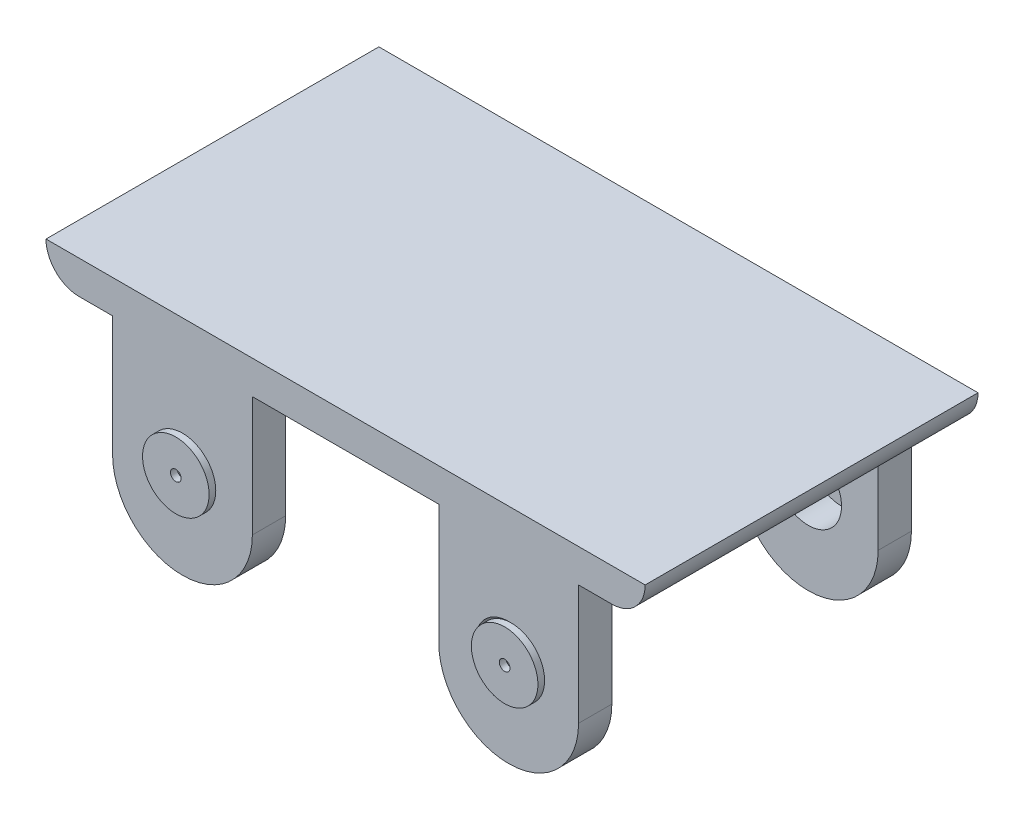
ISO-10303-21;
HEADER;
FILE_DESCRIPTION(('STEP AP214'),'2;1');
FILE_NAME('part.step','',(''),(''),'','','');
FILE_SCHEMA(('AUTOMOTIVE_DESIGN { 1 0 10303 214 1 1 1 1 }'));
ENDSEC;
DATA;
#1=APPLICATION_CONTEXT('core data for automotive mechanical design processes');
#2=APPLICATION_PROTOCOL_DEFINITION('international standard','automotive_design',2000,#1);
#3=PRODUCT_CONTEXT('',#1,'mechanical');
#4=PRODUCT('Part','Part','',(#3));
#5=PRODUCT_RELATED_PRODUCT_CATEGORY('part','',(#4));
#6=PRODUCT_DEFINITION_FORMATION('','',#4);
#7=PRODUCT_DEFINITION_CONTEXT('part definition',#1,'design');
#8=PRODUCT_DEFINITION('design','',#6,#7);
#9=PRODUCT_DEFINITION_SHAPE('','',#8);
#10=(LENGTH_UNIT() NAMED_UNIT(*) SI_UNIT(.MILLI.,.METRE.));
#11=(NAMED_UNIT(*) PLANE_ANGLE_UNIT() SI_UNIT($,.RADIAN.));
#12=(NAMED_UNIT(*) SI_UNIT($,.STERADIAN.) SOLID_ANGLE_UNIT());
#13=UNCERTAINTY_MEASURE_WITH_UNIT(LENGTH_MEASURE(1.E-05),#10,'distance_accuracy_value','');
#14=(GEOMETRIC_REPRESENTATION_CONTEXT(3) GLOBAL_UNCERTAINTY_ASSIGNED_CONTEXT((#13)) GLOBAL_UNIT_ASSIGNED_CONTEXT((#10,
#11,#12)) REPRESENTATION_CONTEXT('',''));
#15=CARTESIAN_POINT('',(0.,0.,0.));
#16=DIRECTION('',(0.,0.,1.));
#17=DIRECTION('',(1.,0.,0.));
#18=AXIS2_PLACEMENT_3D('',#15,#16,#17);
#19=CARTESIAN_POINT('',(0.,0.,0.));
#20=DIRECTION('',(0.,-1.,0.));
#21=DIRECTION('',(0.,0.,-1.));
#22=AXIS2_PLACEMENT_3D('',#19,#20,#21);
#23=PLANE('',#22);
#24=DIRECTION('',(-1.,0.,0.));
#25=VECTOR('',#24,1.);
#26=CARTESIAN_POINT('',(0.,0.,-50.));
#27=LINE('',#26,#25);
#28=CARTESIAN_POINT('',(10.,0.,-50.));
#29=VERTEX_POINT('',#28);
#30=CARTESIAN_POINT('',(5.,0.,-50.));
#31=VERTEX_POINT('',#30);
#32=EDGE_CURVE('E212',#29,#31,#27,.T.);
#33=ORIENTED_EDGE('',*,*,#32,.F.);
#34=DIRECTION('',(0.,0.,-1.));
#35=VECTOR('',#34,1.);
#36=CARTESIAN_POINT('',(10.,0.,-45.));
#37=LINE('',#36,#35);
#38=CARTESIAN_POINT('',(10.,0.,-45.));
#39=VERTEX_POINT('',#38);
#40=EDGE_CURVE('E194',#39,#29,#37,.T.);
#41=ORIENTED_EDGE('',*,*,#40,.F.);
#42=DIRECTION('',(-1.,0.,0.));
#43=VECTOR('',#42,1.);
#44=CARTESIAN_POINT('',(31.,0.,-45.));
#45=LINE('',#44,#43);
#46=CARTESIAN_POINT('',(31.,0.,-45.));
#47=VERTEX_POINT('',#46);
#48=EDGE_CURVE('E271',#47,#39,#45,.T.);
#49=ORIENTED_EDGE('',*,*,#48,.F.);
#50=DIRECTION('',(0.,0.,-1.));
#51=VECTOR('',#50,1.);
#52=CARTESIAN_POINT('',(31.,0.,-45.));
#53=LINE('',#52,#51);
#54=CARTESIAN_POINT('',(31.,0.,-50.));
#55=VERTEX_POINT('',#54);
#56=EDGE_CURVE('E315',#47,#55,#53,.T.);
#57=ORIENTED_EDGE('',*,*,#56,.T.);
#58=CARTESIAN_POINT('',(59.,0.,-50.));
#59=VERTEX_POINT('',#58);
#60=EDGE_CURVE('E224',#59,#55,#27,.T.);
#61=ORIENTED_EDGE('',*,*,#60,.F.);
#62=DIRECTION('',(0.,0.,-1.));
#63=VECTOR('',#62,1.);
#64=CARTESIAN_POINT('',(59.,0.,-45.));
#65=LINE('',#64,#63);
#66=CARTESIAN_POINT('',(59.,0.,-45.));
#67=VERTEX_POINT('',#66);
#68=EDGE_CURVE('E342',#67,#59,#65,.T.);
#69=ORIENTED_EDGE('',*,*,#68,.F.);
#70=DIRECTION('',(-1.,0.,0.));
#71=VECTOR('',#70,1.);
#72=CARTESIAN_POINT('',(80.,0.,-45.));
#73=LINE('',#72,#71);
#74=CARTESIAN_POINT('',(80.,0.,-45.));
#75=VERTEX_POINT('',#74);
#76=EDGE_CURVE('E326',#75,#67,#73,.T.);
#77=ORIENTED_EDGE('',*,*,#76,.F.);
#78=DIRECTION('',(0.,0.,-1.));
#79=VECTOR('',#78,1.);
#80=CARTESIAN_POINT('',(80.,0.,-45.));
#81=LINE('',#80,#79);
#82=CARTESIAN_POINT('',(80.,0.,-50.));
#83=VERTEX_POINT('',#82);
#84=EDGE_CURVE('E319',#75,#83,#81,.T.);
#85=ORIENTED_EDGE('',*,*,#84,.T.);
#86=CARTESIAN_POINT('',(85.,0.,-50.));
#87=VERTEX_POINT('',#86);
#88=EDGE_CURVE('E226',#87,#83,#27,.T.);
#89=ORIENTED_EDGE('',*,*,#88,.F.);
#90=DIRECTION('',(0.,0.,1.));
#91=VECTOR('',#90,1.);
#92=CARTESIAN_POINT('',(85.,0.,0.));
#93=LINE('',#92,#91);
#94=CARTESIAN_POINT('',(85.,0.,0.));
#95=VERTEX_POINT('',#94);
#96=EDGE_CURVE('E354',#87,#95,#93,.T.);
#97=ORIENTED_EDGE('',*,*,#96,.T.);
#98=DIRECTION('',(1.,0.,0.));
#99=VECTOR('',#98,1.);
#100=CARTESIAN_POINT('',(0.,0.,0.));
#101=LINE('',#100,#99);
#102=CARTESIAN_POINT('',(79.9999999999999,0.,0.));
#103=VERTEX_POINT('',#102);
#104=EDGE_CURVE('E243',#103,#95,#101,.T.);
#105=ORIENTED_EDGE('',*,*,#104,.F.);
#106=DIRECTION('',(0.,0.,1.));
#107=VECTOR('',#106,1.);
#108=CARTESIAN_POINT('',(80.,0.,-5.));
#109=LINE('',#108,#107);
#110=CARTESIAN_POINT('',(80.,0.,-5.));
#111=VERTEX_POINT('',#110);
#112=EDGE_CURVE('E370',#111,#103,#109,.T.);
#113=ORIENTED_EDGE('',*,*,#112,.F.);
#114=DIRECTION('',(1.,0.,0.));
#115=VECTOR('',#114,1.);
#116=CARTESIAN_POINT('',(0.,0.,-5.));
#117=LINE('',#116,#115);
#118=CARTESIAN_POINT('',(59.,0.,-5.));
#119=VERTEX_POINT('',#118);
#120=EDGE_CURVE('E365',#119,#111,#117,.T.);
#121=ORIENTED_EDGE('',*,*,#120,.F.);
#122=DIRECTION('',(0.,0.,1.));
#123=VECTOR('',#122,1.);
#124=CARTESIAN_POINT('',(59.,0.,-5.));
#125=LINE('',#124,#123);
#126=CARTESIAN_POINT('',(59.,0.,0.));
#127=VERTEX_POINT('',#126);
#128=EDGE_CURVE('E387',#119,#127,#125,.T.);
#129=ORIENTED_EDGE('',*,*,#128,.T.);
#130=CARTESIAN_POINT('',(31.,0.,0.));
#131=VERTEX_POINT('',#130);
#132=EDGE_CURVE('E251',#131,#127,#101,.T.);
#133=ORIENTED_EDGE('',*,*,#132,.F.);
#134=DIRECTION('',(0.,0.,1.));
#135=VECTOR('',#134,1.);
#136=CARTESIAN_POINT('',(31.,0.,-5.));
#137=LINE('',#136,#135);
#138=CARTESIAN_POINT('',(31.,0.,-5.));
#139=VERTEX_POINT('',#138);
#140=EDGE_CURVE('E401',#139,#131,#137,.T.);
#141=ORIENTED_EDGE('',*,*,#140,.F.);
#142=DIRECTION('',(-1.,0.,0.));
#143=VECTOR('',#142,1.);
#144=CARTESIAN_POINT('',(0.,0.,-5.));
#145=LINE('',#144,#143);
#146=CARTESIAN_POINT('',(10.,0.,-5.));
#147=VERTEX_POINT('',#146);
#148=EDGE_CURVE('E391',#139,#147,#145,.T.);
#149=ORIENTED_EDGE('',*,*,#148,.T.);
#150=DIRECTION('',(0.,0.,1.));
#151=VECTOR('',#150,1.);
#152=CARTESIAN_POINT('',(10.,0.,-5.));
#153=LINE('',#152,#151);
#154=CARTESIAN_POINT('',(10.,0.,0.));
#155=VERTEX_POINT('',#154);
#156=EDGE_CURVE('E260',#147,#155,#153,.T.);
#157=ORIENTED_EDGE('',*,*,#156,.T.);
#158=CARTESIAN_POINT('',(5.,0.,0.));
#159=VERTEX_POINT('',#158);
#160=EDGE_CURVE('E252',#159,#155,#101,.T.);
#161=ORIENTED_EDGE('',*,*,#160,.F.);
#162=DIRECTION('',(0.,0.,1.));
#163=VECTOR('',#162,1.);
#164=CARTESIAN_POINT('',(5.,0.,-50.));
#165=LINE('',#164,#163);
#166=EDGE_CURVE('E220',#159,#31,#165,.F.);
#167=ORIENTED_EDGE('',*,*,#166,.T.);
#168=EDGE_LOOP('',(#33,#41,#49,#57,#61,#69,#77,#85,#89,#97,#105,#113,#121,#129,#133,#141,#149,
#157,#161,#167));
#169=FACE_BOUND('',#168,.T.);
#170=ADVANCED_FACE('F50',(#169),#23,.T.);
#171=CARTESIAN_POINT('',(85.,5.,0.));
#172=DIRECTION('',(0.,0.,-1.));
#173=DIRECTION('',(-1.,0.,0.));
#174=AXIS2_PLACEMENT_3D('',#171,#172,#173);
#175=CYLINDRICAL_SURFACE('',#174,5.);
#176=ORIENTED_EDGE('',*,*,#96,.F.);
#177=CARTESIAN_POINT('',(85.,5.,-50.));
#178=DIRECTION('',(0.,0.,1.));
#179=DIRECTION('',(1.,0.,0.));
#180=AXIS2_PLACEMENT_3D('',#177,#178,#179);
#181=CIRCLE('',#180,5.);
#182=CARTESIAN_POINT('',(90.,5.,-50.));
#183=VERTEX_POINT('',#182);
#184=EDGE_CURVE('E229',#183,#87,#181,.F.);
#185=ORIENTED_EDGE('',*,*,#184,.F.);
#186=DIRECTION('',(0.,0.,-1.));
#187=VECTOR('',#186,1.);
#188=CARTESIAN_POINT('',(90.,5.,0.));
#189=LINE('',#188,#187);
#190=CARTESIAN_POINT('',(90.,5.,0.));
#191=VERTEX_POINT('',#190);
#192=EDGE_CURVE('E444',#191,#183,#189,.T.);
#193=ORIENTED_EDGE('',*,*,#192,.F.);
#194=CARTESIAN_POINT('',(85.,5.,0.));
#195=DIRECTION('',(0.,0.,-1.));
#196=DIRECTION('',(-1.,0.,0.));
#197=AXIS2_PLACEMENT_3D('',#194,#195,#196);
#198=CIRCLE('',#197,5.);
#199=EDGE_CURVE('E239',#95,#191,#198,.F.);
#200=ORIENTED_EDGE('',*,*,#199,.F.);
#201=EDGE_LOOP('',(#176,#185,#193,#200));
#202=FACE_BOUND('',#201,.T.);
#203=ADVANCED_FACE('F511',(#202),#175,.T.);
#204=CARTESIAN_POINT('',(0.,5.,0.));
#205=DIRECTION('',(0.,0.,-1.));
#206=DIRECTION('',(-1.,0.,0.));
#207=AXIS2_PLACEMENT_3D('',#204,#205,#206);
#208=PLANE('',#207);
#209=CARTESIAN_POINT('',(69.5,-15.,0.));
#210=DIRECTION('',(0.,0.,1.));
#211=DIRECTION('',(1.,0.,0.));
#212=AXIS2_PLACEMENT_3D('',#209,#210,#211);
#213=CIRCLE('',#212,5.);
#214=CARTESIAN_POINT('',(69.6979157307919,-10.0039185991915,0.));
#215=VERTEX_POINT('',#214);
#216=CARTESIAN_POINT('',(69.6979157307919,-19.9960814008086,0.));
#217=VERTEX_POINT('',#216);
#218=EDGE_CURVE('E66',#215,#217,#213,.T.);
#219=ORIENTED_EDGE('',*,*,#218,.F.);
#220=CARTESIAN_POINT('',(69.8958314615839,-15.,0.));
#221=DIRECTION('',(0.,0.,-1.));
#222=DIRECTION('',(-1.,0.,0.));
#223=AXIS2_PLACEMENT_3D('',#220,#221,#222);
#224=CIRCLE('',#223,5.);
#225=EDGE_CURVE('E262',#217,#215,#224,.F.);
#226=ORIENTED_EDGE('',*,*,#225,.F.);
#227=EDGE_LOOP('',(#219,#226));
#228=FACE_BOUND('',#227,.T.);
#229=CARTESIAN_POINT('',(20.5,-15.,0.));
#230=DIRECTION('',(0.,0.,1.));
#231=DIRECTION('',(1.,0.,0.));
#232=AXIS2_PLACEMENT_3D('',#229,#230,#231);
#233=CIRCLE('',#232,5.);
#234=CARTESIAN_POINT('',(25.5,-15.,0.));
#235=VERTEX_POINT('',#234);
#236=EDGE_CURVE('E258',#235,#235,#233,.F.);
#237=ORIENTED_EDGE('',*,*,#236,.T.);
#238=EDGE_LOOP('',(#237));
#239=FACE_BOUND('',#238,.T.);
#240=DIRECTION('',(1.,0.,0.));
#241=VECTOR('',#240,1.);
#242=CARTESIAN_POINT('',(0.,5.,0.));
#243=LINE('',#242,#241);
#244=CARTESIAN_POINT('',(0.,5.,0.));
#245=VERTEX_POINT('',#244);
#246=EDGE_CURVE('E441',#245,#191,#243,.T.);
#247=ORIENTED_EDGE('',*,*,#246,.F.);
#248=CARTESIAN_POINT('',(5.,5.,0.));
#249=DIRECTION('',(0.,0.,-1.));
#250=DIRECTION('',(-1.,0.,0.));
#251=AXIS2_PLACEMENT_3D('',#248,#249,#250);
#252=CIRCLE('',#251,5.);
#253=EDGE_CURVE('E255',#245,#159,#252,.F.);
#254=ORIENTED_EDGE('',*,*,#253,.T.);
#255=ORIENTED_EDGE('',*,*,#160,.T.);
#256=DIRECTION('',(0.,-1.,0.));
#257=VECTOR('',#256,1.);
#258=CARTESIAN_POINT('',(10.,0.,0.));
#259=LINE('',#258,#257);
#260=CARTESIAN_POINT('',(10.,-18.,0.));
#261=VERTEX_POINT('',#260);
#262=EDGE_CURVE('E423',#155,#261,#259,.T.);
#263=ORIENTED_EDGE('',*,*,#262,.T.);
#264=CARTESIAN_POINT('',(20.5,-18.,0.));
#265=DIRECTION('',(0.,0.,1.));
#266=DIRECTION('',(1.,0.,0.));
#267=AXIS2_PLACEMENT_3D('',#264,#265,#266);
#268=CIRCLE('',#267,10.5);
#269=CARTESIAN_POINT('',(31.,-18.,0.));
#270=VERTEX_POINT('',#269);
#271=EDGE_CURVE('E415',#270,#261,#268,.F.);
#272=ORIENTED_EDGE('',*,*,#271,.F.);
#273=DIRECTION('',(0.,1.,0.));
#274=VECTOR('',#273,1.);
#275=CARTESIAN_POINT('',(31.,0.,0.));
#276=LINE('',#275,#274);
#277=EDGE_CURVE('E420',#270,#131,#276,.T.);
#278=ORIENTED_EDGE('',*,*,#277,.T.);
#279=ORIENTED_EDGE('',*,*,#132,.T.);
#280=DIRECTION('',(0.,1.,0.));
#281=VECTOR('',#280,1.);
#282=CARTESIAN_POINT('',(59.,0.,0.));
#283=LINE('',#282,#281);
#284=CARTESIAN_POINT('',(59.,-18.,0.));
#285=VERTEX_POINT('',#284);
#286=EDGE_CURVE('E375',#285,#127,#283,.T.);
#287=ORIENTED_EDGE('',*,*,#286,.F.);
#288=CARTESIAN_POINT('',(69.5,-18.,0.));
#289=DIRECTION('',(0.,0.,1.));
#290=DIRECTION('',(1.,0.,0.));
#291=AXIS2_PLACEMENT_3D('',#288,#289,#290);
#292=CIRCLE('',#291,10.5);
#293=CARTESIAN_POINT('',(80.,-18.,0.));
#294=VERTEX_POINT('',#293);
#295=EDGE_CURVE('E250',#285,#294,#292,.T.);
#296=ORIENTED_EDGE('',*,*,#295,.T.);
#297=DIRECTION('',(0.,-1.,0.));
#298=VECTOR('',#297,1.);
#299=CARTESIAN_POINT('',(80.,0.,0.));
#300=LINE('',#299,#298);
#301=EDGE_CURVE('E383',#103,#294,#300,.T.);
#302=ORIENTED_EDGE('',*,*,#301,.F.);
#303=ORIENTED_EDGE('',*,*,#104,.T.);
#304=ORIENTED_EDGE('',*,*,#199,.T.);
#305=EDGE_LOOP('',(#247,#254,#255,#263,#272,#278,#279,#287,#296,#302,#303,#304));
#306=FACE_BOUND('',#305,.T.);
#307=ADVANCED_FACE('F456',(#228,#239,#306),#208,.F.);
#308=CARTESIAN_POINT('',(0.,5.,-50.));
#309=DIRECTION('',(0.,0.,1.));
#310=DIRECTION('',(1.,0.,0.));
#311=AXIS2_PLACEMENT_3D('',#308,#309,#310);
#312=PLANE('',#311);
#313=CARTESIAN_POINT('',(69.5,-15.,-50.0000000000005));
#314=DIRECTION('',(0.,0.,-1.));
#315=DIRECTION('',(-1.,0.,0.));
#316=AXIS2_PLACEMENT_3D('',#313,#314,#315);
#317=CIRCLE('',#316,4.99999999999999);
#318=CARTESIAN_POINT('',(64.5,-15.,-50.0000000000005));
#319=VERTEX_POINT('',#318);
#320=EDGE_CURVE('E54',#319,#319,#317,.F.);
#321=ORIENTED_EDGE('',*,*,#320,.T.);
#322=EDGE_LOOP('',(#321));
#323=FACE_BOUND('',#322,.T.);
#324=CARTESIAN_POINT('',(20.5,-15.,-50.0000000000001));
#325=DIRECTION('',(0.,0.,-1.));
#326=DIRECTION('',(-1.,0.,0.));
#327=AXIS2_PLACEMENT_3D('',#324,#325,#326);
#328=CIRCLE('',#327,5.);
#329=CARTESIAN_POINT('',(15.5,-15.,-50.0000000000001));
#330=VERTEX_POINT('',#329);
#331=EDGE_CURVE('E12',#330,#330,#328,.T.);
#332=ORIENTED_EDGE('',*,*,#331,.F.);
#333=EDGE_LOOP('',(#332));
#334=FACE_BOUND('',#333,.T.);
#335=ORIENTED_EDGE('',*,*,#88,.T.);
#336=DIRECTION('',(0.,1.,0.));
#337=VECTOR('',#336,1.);
#338=CARTESIAN_POINT('',(80.,0.,-50.));
#339=LINE('',#338,#337);
#340=CARTESIAN_POINT('',(80.,-18.,-50.));
#341=VERTEX_POINT('',#340);
#342=EDGE_CURVE('E348',#341,#83,#339,.T.);
#343=ORIENTED_EDGE('',*,*,#342,.F.);
#344=CARTESIAN_POINT('',(69.5,-18.,-50.));
#345=DIRECTION('',(0.,0.,1.));
#346=DIRECTION('',(-1.,0.,0.));
#347=AXIS2_PLACEMENT_3D('',#344,#345,#346);
#348=CIRCLE('',#347,10.5);
#349=CARTESIAN_POINT('',(59.,-18.,-50.));
#350=VERTEX_POINT('',#349);
#351=EDGE_CURVE('E344',#350,#341,#348,.T.);
#352=ORIENTED_EDGE('',*,*,#351,.F.);
#353=DIRECTION('',(0.,-1.,0.));
#354=VECTOR('',#353,1.);
#355=CARTESIAN_POINT('',(59.,0.,-50.));
#356=LINE('',#355,#354);
#357=EDGE_CURVE('E339',#59,#350,#356,.T.);
#358=ORIENTED_EDGE('',*,*,#357,.F.);
#359=ORIENTED_EDGE('',*,*,#60,.T.);
#360=DIRECTION('',(0.,1.,0.));
#361=VECTOR('',#360,1.);
#362=CARTESIAN_POINT('',(31.,0.,-50.));
#363=LINE('',#362,#361);
#364=CARTESIAN_POINT('',(31.,-18.,-50.));
#365=VERTEX_POINT('',#364);
#366=EDGE_CURVE('E312',#365,#55,#363,.T.);
#367=ORIENTED_EDGE('',*,*,#366,.F.);
#368=CARTESIAN_POINT('',(20.5,-18.,-50.));
#369=DIRECTION('',(0.,0.,1.));
#370=DIRECTION('',(-1.,0.,0.));
#371=AXIS2_PLACEMENT_3D('',#368,#369,#370);
#372=CIRCLE('',#371,10.5);
#373=CARTESIAN_POINT('',(10.,-18.,-50.));
#374=VERTEX_POINT('',#373);
#375=EDGE_CURVE('E206',#374,#365,#372,.T.);
#376=ORIENTED_EDGE('',*,*,#375,.F.);
#377=DIRECTION('',(0.,-1.,0.));
#378=VECTOR('',#377,1.);
#379=CARTESIAN_POINT('',(10.,0.,-50.));
#380=LINE('',#379,#378);
#381=EDGE_CURVE('E198',#29,#374,#380,.T.);
#382=ORIENTED_EDGE('',*,*,#381,.F.);
#383=ORIENTED_EDGE('',*,*,#32,.T.);
#384=CARTESIAN_POINT('',(5.,5.,-50.));
#385=DIRECTION('',(0.,0.,1.));
#386=DIRECTION('',(1.,0.,0.));
#387=AXIS2_PLACEMENT_3D('',#384,#385,#386);
#388=CIRCLE('',#387,5.);
#389=CARTESIAN_POINT('',(0.,5.,-50.));
#390=VERTEX_POINT('',#389);
#391=EDGE_CURVE('E223',#31,#390,#388,.F.);
#392=ORIENTED_EDGE('',*,*,#391,.T.);
#393=DIRECTION('',(-1.,0.,0.));
#394=VECTOR('',#393,1.);
#395=CARTESIAN_POINT('',(0.,5.,-50.));
#396=LINE('',#395,#394);
#397=EDGE_CURVE('E419',#183,#390,#396,.T.);
#398=ORIENTED_EDGE('',*,*,#397,.F.);
#399=ORIENTED_EDGE('',*,*,#184,.T.);
#400=EDGE_LOOP('',(#335,#343,#352,#358,#359,#367,#376,#382,#383,#392,#398,#399));
#401=FACE_BOUND('',#400,.T.);
#402=ADVANCED_FACE('F211',(#323,#334,#401),#312,.F.);
#403=CARTESIAN_POINT('',(0.,5.,0.));
#404=DIRECTION('',(0.,-1.,0.));
#405=DIRECTION('',(0.,0.,-1.));
#406=AXIS2_PLACEMENT_3D('',#403,#404,#405);
#407=PLANE('',#406);
#408=DIRECTION('',(0.,0.,1.));
#409=VECTOR('',#408,1.);
#410=CARTESIAN_POINT('',(0.,5.,0.));
#411=LINE('',#410,#409);
#412=EDGE_CURVE('E437',#390,#245,#411,.T.);
#413=ORIENTED_EDGE('',*,*,#412,.T.);
#414=ORIENTED_EDGE('',*,*,#246,.T.);
#415=ORIENTED_EDGE('',*,*,#192,.T.);
#416=ORIENTED_EDGE('',*,*,#397,.T.);
#417=EDGE_LOOP('',(#413,#414,#415,#416));
#418=FACE_BOUND('',#417,.T.);
#419=ADVANCED_FACE('F535',(#418),#407,.F.);
#420=CARTESIAN_POINT('',(5.,5.,0.));
#421=DIRECTION('',(0.,0.,-1.));
#422=DIRECTION('',(-1.,0.,0.));
#423=AXIS2_PLACEMENT_3D('',#420,#421,#422);
#424=CYLINDRICAL_SURFACE('',#423,5.);
#425=ORIENTED_EDGE('',*,*,#391,.F.);
#426=ORIENTED_EDGE('',*,*,#166,.F.);
#427=ORIENTED_EDGE('',*,*,#253,.F.);
#428=ORIENTED_EDGE('',*,*,#412,.F.);
#429=EDGE_LOOP('',(#425,#426,#427,#428));
#430=FACE_BOUND('',#429,.T.);
#431=ADVANCED_FACE('F539',(#430),#424,.T.);
#432=CARTESIAN_POINT('',(20.5,-18.,-5.));
#433=DIRECTION('',(0.,0.,1.));
#434=DIRECTION('',(1.,0.,0.));
#435=AXIS2_PLACEMENT_3D('',#432,#433,#434);
#436=CYLINDRICAL_SURFACE('',#435,10.5);
#437=ORIENTED_EDGE('',*,*,#271,.T.);
#438=DIRECTION('',(0.,0.,1.));
#439=VECTOR('',#438,1.);
#440=CARTESIAN_POINT('',(10.,-18.,-5.));
#441=LINE('',#440,#439);
#442=CARTESIAN_POINT('',(10.,-18.,-5.));
#443=VERTEX_POINT('',#442);
#444=EDGE_CURVE('E406',#443,#261,#441,.T.);
#445=ORIENTED_EDGE('',*,*,#444,.F.);
#446=CARTESIAN_POINT('',(20.5,-18.,-5.));
#447=DIRECTION('',(0.,0.,1.));
#448=DIRECTION('',(1.,0.,0.));
#449=AXIS2_PLACEMENT_3D('',#446,#447,#448);
#450=CIRCLE('',#449,10.5);
#451=CARTESIAN_POINT('',(31.,-18.,-5.));
#452=VERTEX_POINT('',#451);
#453=EDGE_CURVE('E379',#452,#443,#450,.F.);
#454=ORIENTED_EDGE('',*,*,#453,.F.);
#455=DIRECTION('',(0.,0.,1.));
#456=VECTOR('',#455,1.);
#457=CARTESIAN_POINT('',(31.,-18.,-5.));
#458=LINE('',#457,#456);
#459=EDGE_CURVE('E414',#452,#270,#458,.T.);
#460=ORIENTED_EDGE('',*,*,#459,.T.);
#461=EDGE_LOOP('',(#437,#445,#454,#460));
#462=FACE_BOUND('',#461,.T.);
#463=ADVANCED_FACE('F541',(#462),#436,.T.);
#464=CARTESIAN_POINT('',(10.,0.,-5.));
#465=DIRECTION('',(-1.,0.,0.));
#466=DIRECTION('',(0.,0.,1.));
#467=AXIS2_PLACEMENT_3D('',#464,#465,#466);
#468=PLANE('',#467);
#469=ORIENTED_EDGE('',*,*,#262,.F.);
#470=ORIENTED_EDGE('',*,*,#156,.F.);
#471=DIRECTION('',(0.,-1.,0.));
#472=VECTOR('',#471,1.);
#473=CARTESIAN_POINT('',(10.,0.,-5.));
#474=LINE('',#473,#472);
#475=EDGE_CURVE('E410',#147,#443,#474,.T.);
#476=ORIENTED_EDGE('',*,*,#475,.T.);
#477=ORIENTED_EDGE('',*,*,#444,.T.);
#478=EDGE_LOOP('',(#469,#470,#476,#477));
#479=FACE_BOUND('',#478,.T.);
#480=ADVANCED_FACE('F604',(#479),#468,.T.);
#481=CARTESIAN_POINT('',(31.,0.,-5.));
#482=DIRECTION('',(1.,0.,0.));
#483=DIRECTION('',(0.,1.,0.));
#484=AXIS2_PLACEMENT_3D('',#481,#482,#483);
#485=PLANE('',#484);
#486=ORIENTED_EDGE('',*,*,#277,.F.);
#487=ORIENTED_EDGE('',*,*,#459,.F.);
#488=DIRECTION('',(0.,1.,0.));
#489=VECTOR('',#488,1.);
#490=CARTESIAN_POINT('',(31.,0.,-5.));
#491=LINE('',#490,#489);
#492=EDGE_CURVE('E402',#452,#139,#491,.T.);
#493=ORIENTED_EDGE('',*,*,#492,.T.);
#494=ORIENTED_EDGE('',*,*,#140,.T.);
#495=EDGE_LOOP('',(#486,#487,#493,#494));
#496=FACE_BOUND('',#495,.T.);
#497=ADVANCED_FACE('F602',(#496),#485,.T.);
#498=CARTESIAN_POINT('',(0.,0.,-5.));
#499=DIRECTION('',(0.,0.,1.));
#500=DIRECTION('',(1.,0.,0.));
#501=AXIS2_PLACEMENT_3D('',#498,#499,#500);
#502=PLANE('',#501);
#503=CARTESIAN_POINT('',(20.5,-15.,-5.));
#504=DIRECTION('',(0.,0.,1.));
#505=DIRECTION('',(1.,0.,0.));
#506=AXIS2_PLACEMENT_3D('',#503,#504,#505);
#507=CIRCLE('',#506,5.);
#508=CARTESIAN_POINT('',(25.5,-15.,-5.));
#509=VERTEX_POINT('',#508);
#510=EDGE_CURVE('E275',#509,#509,#507,.F.);
#511=ORIENTED_EDGE('',*,*,#510,.F.);
#512=EDGE_LOOP('',(#511));
#513=FACE_BOUND('',#512,.T.);
#514=ORIENTED_EDGE('',*,*,#453,.T.);
#515=ORIENTED_EDGE('',*,*,#475,.F.);
#516=ORIENTED_EDGE('',*,*,#148,.F.);
#517=ORIENTED_EDGE('',*,*,#492,.F.);
#518=EDGE_LOOP('',(#514,#515,#516,#517));
#519=FACE_BOUND('',#518,.T.);
#520=ADVANCED_FACE('F599',(#513,#519),#502,.F.);
#521=CARTESIAN_POINT('',(59.,0.,-5.));
#522=DIRECTION('',(1.,0.,0.));
#523=DIRECTION('',(0.,1.,0.));
#524=AXIS2_PLACEMENT_3D('',#521,#522,#523);
#525=PLANE('',#524);
#526=ORIENTED_EDGE('',*,*,#286,.T.);
#527=ORIENTED_EDGE('',*,*,#128,.F.);
#528=DIRECTION('',(0.,1.,0.));
#529=VECTOR('',#528,1.);
#530=CARTESIAN_POINT('',(59.,0.,-5.));
#531=LINE('',#530,#529);
#532=CARTESIAN_POINT('',(59.,-18.,-5.));
#533=VERTEX_POINT('',#532);
#534=EDGE_CURVE('E292',#533,#119,#531,.T.);
#535=ORIENTED_EDGE('',*,*,#534,.F.);
#536=DIRECTION('',(0.,0.,1.));
#537=VECTOR('',#536,1.);
#538=CARTESIAN_POINT('',(59.,-18.,-5.));
#539=LINE('',#538,#537);
#540=EDGE_CURVE('E378',#533,#285,#539,.T.);
#541=ORIENTED_EDGE('',*,*,#540,.T.);
#542=EDGE_LOOP('',(#526,#527,#535,#541));
#543=FACE_BOUND('',#542,.T.);
#544=ADVANCED_FACE('F466',(#543),#525,.F.);
#545=CARTESIAN_POINT('',(80.,0.,-5.));
#546=DIRECTION('',(-1.,0.,0.));
#547=DIRECTION('',(0.,0.,1.));
#548=AXIS2_PLACEMENT_3D('',#545,#546,#547);
#549=PLANE('',#548);
#550=ORIENTED_EDGE('',*,*,#301,.T.);
#551=DIRECTION('',(0.,0.,1.));
#552=VECTOR('',#551,1.);
#553=CARTESIAN_POINT('',(80.,-18.,-5.));
#554=LINE('',#553,#552);
#555=CARTESIAN_POINT('',(80.,-18.,-5.));
#556=VERTEX_POINT('',#555);
#557=EDGE_CURVE('E293',#556,#294,#554,.T.);
#558=ORIENTED_EDGE('',*,*,#557,.F.);
#559=DIRECTION('',(0.,-1.,0.));
#560=VECTOR('',#559,1.);
#561=CARTESIAN_POINT('',(80.,0.,-5.));
#562=LINE('',#561,#560);
#563=EDGE_CURVE('E343',#111,#556,#562,.T.);
#564=ORIENTED_EDGE('',*,*,#563,.F.);
#565=ORIENTED_EDGE('',*,*,#112,.T.);
#566=EDGE_LOOP('',(#550,#558,#564,#565));
#567=FACE_BOUND('',#566,.T.);
#568=ADVANCED_FACE('F474',(#567),#549,.F.);
#569=CARTESIAN_POINT('',(69.5,-18.,-5.));
#570=DIRECTION('',(0.,0.,1.));
#571=DIRECTION('',(1.,0.,0.));
#572=AXIS2_PLACEMENT_3D('',#569,#570,#571);
#573=CYLINDRICAL_SURFACE('',#572,10.5);
#574=ORIENTED_EDGE('',*,*,#295,.F.);
#575=ORIENTED_EDGE('',*,*,#540,.F.);
#576=CARTESIAN_POINT('',(69.5,-18.,-5.));
#577=DIRECTION('',(0.,0.,1.));
#578=DIRECTION('',(1.,0.,0.));
#579=AXIS2_PLACEMENT_3D('',#576,#577,#578);
#580=CIRCLE('',#579,10.5);
#581=EDGE_CURVE('E366',#533,#556,#580,.T.);
#582=ORIENTED_EDGE('',*,*,#581,.T.);
#583=ORIENTED_EDGE('',*,*,#557,.T.);
#584=EDGE_LOOP('',(#574,#575,#582,#583));
#585=FACE_BOUND('',#584,.T.);
#586=ADVANCED_FACE('F469',(#585),#573,.T.);
#587=CARTESIAN_POINT('',(0.,0.,-5.));
#588=DIRECTION('',(0.,0.,1.));
#589=DIRECTION('',(1.,0.,0.));
#590=AXIS2_PLACEMENT_3D('',#587,#588,#589);
#591=PLANE('',#590);
#592=CARTESIAN_POINT('',(69.5,-15.,-5.));
#593=DIRECTION('',(0.,0.,1.));
#594=DIRECTION('',(1.,0.,0.));
#595=AXIS2_PLACEMENT_3D('',#592,#593,#594);
#596=CIRCLE('',#595,5.);
#597=CARTESIAN_POINT('',(74.5,-15.,-5.));
#598=VERTEX_POINT('',#597);
#599=EDGE_CURVE('E289',#598,#598,#596,.T.);
#600=ORIENTED_EDGE('',*,*,#599,.T.);
#601=EDGE_LOOP('',(#600));
#602=FACE_BOUND('',#601,.T.);
#603=ORIENTED_EDGE('',*,*,#534,.T.);
#604=ORIENTED_EDGE('',*,*,#120,.T.);
#605=ORIENTED_EDGE('',*,*,#563,.T.);
#606=ORIENTED_EDGE('',*,*,#581,.F.);
#607=EDGE_LOOP('',(#603,#604,#605,#606));
#608=FACE_BOUND('',#607,.T.);
#609=ADVANCED_FACE('F589',(#602,#608),#591,.F.);
#610=CARTESIAN_POINT('',(59.,0.,-45.));
#611=DIRECTION('',(1.,0.,0.));
#612=DIRECTION('',(0.,1.,0.));
#613=AXIS2_PLACEMENT_3D('',#610,#611,#612);
#614=PLANE('',#613);
#615=ORIENTED_EDGE('',*,*,#357,.T.);
#616=DIRECTION('',(0.,0.,-1.));
#617=VECTOR('',#616,1.);
#618=CARTESIAN_POINT('',(59.,-18.,-45.));
#619=LINE('',#618,#617);
#620=CARTESIAN_POINT('',(59.,-18.,-45.));
#621=VERTEX_POINT('',#620);
#622=EDGE_CURVE('E347',#621,#350,#619,.T.);
#623=ORIENTED_EDGE('',*,*,#622,.F.);
#624=DIRECTION('',(0.,-1.,0.));
#625=VECTOR('',#624,1.);
#626=CARTESIAN_POINT('',(59.,0.,-45.));
#627=LINE('',#626,#625);
#628=EDGE_CURVE('E330',#67,#621,#627,.T.);
#629=ORIENTED_EDGE('',*,*,#628,.F.);
#630=ORIENTED_EDGE('',*,*,#68,.T.);
#631=EDGE_LOOP('',(#615,#623,#629,#630));
#632=FACE_BOUND('',#631,.T.);
#633=ADVANCED_FACE('F564',(#632),#614,.F.);
#634=CARTESIAN_POINT('',(69.5,-18.,-45.));
#635=DIRECTION('',(0.,0.,-1.));
#636=DIRECTION('',(-1.,0.,0.));
#637=AXIS2_PLACEMENT_3D('',#634,#635,#636);
#638=CYLINDRICAL_SURFACE('',#637,10.5);
#639=ORIENTED_EDGE('',*,*,#351,.T.);
#640=DIRECTION('',(0.,0.,-1.));
#641=VECTOR('',#640,1.);
#642=CARTESIAN_POINT('',(80.,-18.,-45.));
#643=LINE('',#642,#641);
#644=CARTESIAN_POINT('',(80.,-18.,-45.));
#645=VERTEX_POINT('',#644);
#646=EDGE_CURVE('E331',#645,#341,#643,.T.);
#647=ORIENTED_EDGE('',*,*,#646,.F.);
#648=CARTESIAN_POINT('',(69.5,-18.,-45.));
#649=DIRECTION('',(0.,0.,1.));
#650=DIRECTION('',(-1.,0.,0.));
#651=AXIS2_PLACEMENT_3D('',#648,#649,#650);
#652=CIRCLE('',#651,10.5);
#653=EDGE_CURVE('E334',#621,#645,#652,.T.);
#654=ORIENTED_EDGE('',*,*,#653,.F.);
#655=ORIENTED_EDGE('',*,*,#622,.T.);
#656=EDGE_LOOP('',(#639,#647,#654,#655));
#657=FACE_BOUND('',#656,.T.);
#658=ADVANCED_FACE('F567',(#657),#638,.T.);
#659=CARTESIAN_POINT('',(80.,0.,-45.));
#660=DIRECTION('',(-1.,0.,0.));
#661=DIRECTION('',(0.,0.,1.));
#662=AXIS2_PLACEMENT_3D('',#659,#660,#661);
#663=PLANE('',#662);
#664=ORIENTED_EDGE('',*,*,#342,.T.);
#665=ORIENTED_EDGE('',*,*,#84,.F.);
#666=DIRECTION('',(0.,1.,0.));
#667=VECTOR('',#666,1.);
#668=CARTESIAN_POINT('',(80.,0.,-45.));
#669=LINE('',#668,#667);
#670=EDGE_CURVE('E216',#645,#75,#669,.T.);
#671=ORIENTED_EDGE('',*,*,#670,.F.);
#672=ORIENTED_EDGE('',*,*,#646,.T.);
#673=EDGE_LOOP('',(#664,#665,#671,#672));
#674=FACE_BOUND('',#673,.T.);
#675=ADVANCED_FACE('F575',(#674),#663,.F.);
#676=CARTESIAN_POINT('',(69.5,-18.,-45.));
#677=DIRECTION('',(0.,0.,-1.));
#678=DIRECTION('',(-1.,0.,0.));
#679=AXIS2_PLACEMENT_3D('',#676,#677,#678);
#680=PLANE('',#679);
#681=CARTESIAN_POINT('',(69.5,-15.,-45.0000000000005));
#682=DIRECTION('',(0.,0.,-1.));
#683=DIRECTION('',(-1.,0.,0.));
#684=AXIS2_PLACEMENT_3D('',#681,#682,#683);
#685=CIRCLE('',#684,4.99999999999999);
#686=CARTESIAN_POINT('',(64.5000000000001,-15.,-45.0000000000005));
#687=VERTEX_POINT('',#686);
#688=EDGE_CURVE('E60',#687,#687,#685,.F.);
#689=ORIENTED_EDGE('',*,*,#688,.F.);
#690=EDGE_LOOP('',(#689));
#691=FACE_BOUND('',#690,.T.);
#692=ORIENTED_EDGE('',*,*,#76,.T.);
#693=ORIENTED_EDGE('',*,*,#628,.T.);
#694=ORIENTED_EDGE('',*,*,#653,.T.);
#695=ORIENTED_EDGE('',*,*,#670,.T.);
#696=EDGE_LOOP('',(#692,#693,#694,#695));
#697=FACE_BOUND('',#696,.T.);
#698=ADVANCED_FACE('F571',(#691,#697),#680,.F.);
#699=CARTESIAN_POINT('',(10.,0.,-45.));
#700=DIRECTION('',(1.,0.,0.));
#701=DIRECTION('',(0.,0.,-1.));
#702=AXIS2_PLACEMENT_3D('',#699,#700,#701);
#703=PLANE('',#702);
#704=ORIENTED_EDGE('',*,*,#381,.T.);
#705=DIRECTION('',(0.,0.,-1.));
#706=VECTOR('',#705,1.);
#707=CARTESIAN_POINT('',(10.,-18.,-45.));
#708=LINE('',#707,#706);
#709=CARTESIAN_POINT('',(10.,-18.,-45.));
#710=VERTEX_POINT('',#709);
#711=EDGE_CURVE('E311',#710,#374,#708,.T.);
#712=ORIENTED_EDGE('',*,*,#711,.F.);
#713=DIRECTION('',(0.,-1.,0.));
#714=VECTOR('',#713,1.);
#715=CARTESIAN_POINT('',(10.,0.,-45.));
#716=LINE('',#715,#714);
#717=EDGE_CURVE('E200',#39,#710,#716,.T.);
#718=ORIENTED_EDGE('',*,*,#717,.F.);
#719=ORIENTED_EDGE('',*,*,#40,.T.);
#720=EDGE_LOOP('',(#704,#712,#718,#719));
#721=FACE_BOUND('',#720,.T.);
#722=ADVANCED_FACE('F196',(#721),#703,.F.);
#723=CARTESIAN_POINT('',(20.5,-18.,-45.));
#724=DIRECTION('',(0.,0.,-1.));
#725=DIRECTION('',(-1.,0.,0.));
#726=AXIS2_PLACEMENT_3D('',#723,#724,#725);
#727=CYLINDRICAL_SURFACE('',#726,10.5);
#728=ORIENTED_EDGE('',*,*,#375,.T.);
#729=DIRECTION('',(0.,0.,-1.));
#730=VECTOR('',#729,1.);
#731=CARTESIAN_POINT('',(31.,-18.,-45.));
#732=LINE('',#731,#730);
#733=CARTESIAN_POINT('',(31.,-18.,-45.));
#734=VERTEX_POINT('',#733);
#735=EDGE_CURVE('E272',#734,#365,#732,.T.);
#736=ORIENTED_EDGE('',*,*,#735,.F.);
#737=CARTESIAN_POINT('',(20.5,-18.,-45.));
#738=DIRECTION('',(0.,0.,1.));
#739=DIRECTION('',(-1.,0.,0.));
#740=AXIS2_PLACEMENT_3D('',#737,#738,#739);
#741=CIRCLE('',#740,10.5);
#742=EDGE_CURVE('E304',#710,#734,#741,.T.);
#743=ORIENTED_EDGE('',*,*,#742,.F.);
#744=ORIENTED_EDGE('',*,*,#711,.T.);
#745=EDGE_LOOP('',(#728,#736,#743,#744));
#746=FACE_BOUND('',#745,.T.);
#747=ADVANCED_FACE('F711',(#746),#727,.T.);
#748=CARTESIAN_POINT('',(31.,0.,-45.));
#749=DIRECTION('',(-1.,0.,0.));
#750=DIRECTION('',(0.,-1.,0.));
#751=AXIS2_PLACEMENT_3D('',#748,#749,#750);
#752=PLANE('',#751);
#753=ORIENTED_EDGE('',*,*,#366,.T.);
#754=ORIENTED_EDGE('',*,*,#56,.F.);
#755=DIRECTION('',(0.,1.,0.));
#756=VECTOR('',#755,1.);
#757=CARTESIAN_POINT('',(31.,0.,-45.));
#758=LINE('',#757,#756);
#759=EDGE_CURVE('E266',#734,#47,#758,.T.);
#760=ORIENTED_EDGE('',*,*,#759,.F.);
#761=ORIENTED_EDGE('',*,*,#735,.T.);
#762=EDGE_LOOP('',(#753,#754,#760,#761));
#763=FACE_BOUND('',#762,.T.);
#764=ADVANCED_FACE('F553',(#763),#752,.F.);
#765=CARTESIAN_POINT('',(20.5,-18.,-45.));
#766=DIRECTION('',(0.,0.,-1.));
#767=DIRECTION('',(-1.,0.,0.));
#768=AXIS2_PLACEMENT_3D('',#765,#766,#767);
#769=PLANE('',#768);
#770=CARTESIAN_POINT('',(20.5,-15.,-45.0000000000001));
#771=DIRECTION('',(0.,0.,-1.));
#772=DIRECTION('',(-1.,0.,0.));
#773=AXIS2_PLACEMENT_3D('',#770,#771,#772);
#774=CIRCLE('',#773,5.);
#775=CARTESIAN_POINT('',(15.5,-15.,-45.0000000000001));
#776=VERTEX_POINT('',#775);
#777=EDGE_CURVE('E267',#776,#776,#774,.T.);
#778=ORIENTED_EDGE('',*,*,#777,.T.);
#779=EDGE_LOOP('',(#778));
#780=FACE_BOUND('',#779,.T.);
#781=ORIENTED_EDGE('',*,*,#48,.T.);
#782=ORIENTED_EDGE('',*,*,#717,.T.);
#783=ORIENTED_EDGE('',*,*,#742,.T.);
#784=ORIENTED_EDGE('',*,*,#759,.T.);
#785=EDGE_LOOP('',(#781,#782,#783,#784));
#786=FACE_BOUND('',#785,.T.);
#787=ADVANCED_FACE('F505',(#780,#786),#769,.F.);
#788=CARTESIAN_POINT('',(69.8958314615839,-15.,1.));
#789=DIRECTION('',(0.,0.,-1.));
#790=DIRECTION('',(-1.,0.,0.));
#791=AXIS2_PLACEMENT_3D('',#788,#789,#790);
#792=CYLINDRICAL_SURFACE('',#791,5.);
#793=CARTESIAN_POINT('',(69.8958314615839,-15.,1.));
#794=DIRECTION('',(0.,0.,1.));
#795=DIRECTION('',(-1.,0.,0.));
#796=AXIS2_PLACEMENT_3D('',#793,#794,#795);
#797=CIRCLE('',#796,5.);
#798=CARTESIAN_POINT('',(64.8958314615839,-15.,1.));
#799=VERTEX_POINT('',#798);
#800=EDGE_CURVE('E296',#799,#799,#797,.T.);
#801=ORIENTED_EDGE('',*,*,#800,.F.);
#802=EDGE_LOOP('',(#801));
#803=FACE_BOUND('',#802,.T.);
#804=ORIENTED_EDGE('',*,*,#225,.T.);
#805=EDGE_CURVE('E73',#215,#217,#224,.F.);
#806=ORIENTED_EDGE('',*,*,#805,.T.);
#807=EDGE_LOOP('',(#804,#806));
#808=FACE_BOUND('',#807,.T.);
#809=ADVANCED_FACE('F499',(#803,#808),#792,.T.);
#810=CARTESIAN_POINT('',(69.8958314615839,-15.,1.));
#811=DIRECTION('',(0.,0.,-1.));
#812=DIRECTION('',(-1.,0.,0.));
#813=AXIS2_PLACEMENT_3D('',#810,#811,#812);
#814=PLANE('',#813);
#815=CARTESIAN_POINT('',(69.8958314615839,-15.,1.));
#816=DIRECTION('',(0.,0.,-1.));
#817=DIRECTION('',(-1.,0.,0.));
#818=AXIS2_PLACEMENT_3D('',#815,#816,#817);
#819=CIRCLE('',#818,0.799999999999995);
#820=CARTESIAN_POINT('',(69.0958314615839,-15.,1.));
#821=VERTEX_POINT('',#820);
#822=EDGE_CURVE('E320',#821,#821,#819,.F.);
#823=ORIENTED_EDGE('',*,*,#822,.F.);
#824=EDGE_LOOP('',(#823));
#825=FACE_BOUND('',#824,.T.);
#826=ORIENTED_EDGE('',*,*,#800,.T.);
#827=EDGE_LOOP('',(#826));
#828=FACE_BOUND('',#827,.T.);
#829=ADVANCED_FACE('F496',(#825,#828),#814,.F.);
#830=CARTESIAN_POINT('',(69.5,-15.,0.));
#831=DIRECTION('',(0.,0.,1.));
#832=DIRECTION('',(1.,0.,0.));
#833=AXIS2_PLACEMENT_3D('',#830,#831,#832);
#834=PLANE('',#833);
#835=CARTESIAN_POINT('',(69.8958314615839,-15.,0.));
#836=DIRECTION('',(0.,0.,1.));
#837=DIRECTION('',(1.,0.,0.));
#838=AXIS2_PLACEMENT_3D('',#835,#836,#837);
#839=CIRCLE('',#838,0.799999999999995);
#840=CARTESIAN_POINT('',(70.6958314615839,-15.,0.));
#841=VERTEX_POINT('',#840);
#842=EDGE_CURVE('E482',#841,#841,#839,.T.);
#843=ORIENTED_EDGE('',*,*,#842,.T.);
#844=EDGE_LOOP('',(#843));
#845=FACE_BOUND('',#844,.T.);
#846=EDGE_CURVE('E280',#217,#215,#213,.T.);
#847=ORIENTED_EDGE('',*,*,#846,.F.);
#848=ORIENTED_EDGE('',*,*,#805,.F.);
#849=EDGE_LOOP('',(#847,#848));
#850=FACE_BOUND('',#849,.T.);
#851=ADVANCED_FACE('F487',(#845,#850),#834,.F.);
#852=CARTESIAN_POINT('',(69.5,-15.,0.));
#853=DIRECTION('',(0.,0.,-1.));
#854=DIRECTION('',(-1.,0.,0.));
#855=AXIS2_PLACEMENT_3D('',#852,#853,#854);
#856=CYLINDRICAL_SURFACE('',#855,5.);
#857=ORIENTED_EDGE('',*,*,#218,.T.);
#858=ORIENTED_EDGE('',*,*,#846,.T.);
#859=EDGE_LOOP('',(#857,#858));
#860=FACE_BOUND('',#859,.T.);
#861=ORIENTED_EDGE('',*,*,#599,.F.);
#862=EDGE_LOOP('',(#861));
#863=FACE_BOUND('',#862,.T.);
#864=ADVANCED_FACE('F519',(#860,#863),#856,.F.);
#865=CARTESIAN_POINT('',(20.5,-15.,0.));
#866=DIRECTION('',(0.,0.,-1.));
#867=DIRECTION('',(-1.,0.,0.));
#868=AXIS2_PLACEMENT_3D('',#865,#866,#867);
#869=CYLINDRICAL_SURFACE('',#868,5.);
#870=ORIENTED_EDGE('',*,*,#236,.F.);
#871=EDGE_LOOP('',(#870));
#872=FACE_BOUND('',#871,.T.);
#873=ORIENTED_EDGE('',*,*,#510,.T.);
#874=EDGE_LOOP('',(#873));
#875=FACE_BOUND('',#874,.T.);
#876=ADVANCED_FACE('F517',(#872,#875),#869,.F.);
#877=CARTESIAN_POINT('',(69.5,-15.,-50.0000000000005));
#878=DIRECTION('',(0.,0.,1.));
#879=DIRECTION('',(1.,0.,0.));
#880=AXIS2_PLACEMENT_3D('',#877,#878,#879);
#881=CYLINDRICAL_SURFACE('',#880,4.99999999999999);
#882=ORIENTED_EDGE('',*,*,#320,.F.);
#883=EDGE_LOOP('',(#882));
#884=FACE_BOUND('',#883,.T.);
#885=ORIENTED_EDGE('',*,*,#688,.T.);
#886=EDGE_LOOP('',(#885));
#887=FACE_BOUND('',#886,.T.);
#888=ADVANCED_FACE('F52',(#884,#887),#881,.F.);
#889=CARTESIAN_POINT('',(20.5,-15.,-50.0000000000001));
#890=DIRECTION('',(0.,0.,1.));
#891=DIRECTION('',(1.,0.,0.));
#892=AXIS2_PLACEMENT_3D('',#889,#890,#891);
#893=CYLINDRICAL_SURFACE('',#892,5.);
#894=ORIENTED_EDGE('',*,*,#331,.T.);
#895=EDGE_LOOP('',(#894));
#896=FACE_BOUND('',#895,.T.);
#897=ORIENTED_EDGE('',*,*,#777,.F.);
#898=EDGE_LOOP('',(#897));
#899=FACE_BOUND('',#898,.T.);
#900=ADVANCED_FACE('F492',(#896,#899),#893,.F.);
#901=CARTESIAN_POINT('',(69.8958314615839,-15.,5.));
#902=DIRECTION('',(0.,0.,-1.));
#903=DIRECTION('',(-1.,0.,0.));
#904=AXIS2_PLACEMENT_3D('',#901,#902,#903);
#905=CYLINDRICAL_SURFACE('',#904,0.799999999999995);
#906=ORIENTED_EDGE('',*,*,#842,.F.);
#907=EDGE_LOOP('',(#906));
#908=FACE_BOUND('',#907,.T.);
#909=ORIENTED_EDGE('',*,*,#822,.T.);
#910=EDGE_LOOP('',(#909));
#911=FACE_BOUND('',#910,.T.);
#912=ADVANCED_FACE('F489',(#908,#911),#905,.F.);
#913=CLOSED_SHELL('',(#170,#203,#307,#402,#419,#431,#463,#480,#497,#520,#544,#568,#586,#609,
#633,#658,#675,#698,#722,#747,#764,#787,#809,#829,#851,#864,#876,#888,#900,#912));
#914=MANIFOLD_SOLID_BREP('B2',#913);
#915=CARTESIAN_POINT('',(69.5000000000003,-15.,-51.));
#916=DIRECTION('',(0.,0.,1.));
#917=DIRECTION('',(1.,0.,0.));
#918=AXIS2_PLACEMENT_3D('',#915,#916,#917);
#919=PLANE('',#918);
#920=CARTESIAN_POINT('',(69.5000000000003,-15.,-51.));
#921=DIRECTION('',(0.,0.,1.));
#922=DIRECTION('',(1.,0.,0.));
#923=AXIS2_PLACEMENT_3D('',#920,#921,#922);
#924=CIRCLE('',#923,0.799999999999995);
#925=CARTESIAN_POINT('',(70.3000000000003,-15.,-51.));
#926=VERTEX_POINT('',#925);
#927=EDGE_CURVE('E845',#926,#926,#924,.F.);
#928=ORIENTED_EDGE('',*,*,#927,.F.);
#929=EDGE_LOOP('',(#928));
#930=FACE_BOUND('',#929,.T.);
#931=CARTESIAN_POINT('',(69.5000000000003,-15.,-51.));
#932=DIRECTION('',(0.,0.,1.));
#933=DIRECTION('',(1.,0.,0.));
#934=AXIS2_PLACEMENT_3D('',#931,#932,#933);
#935=CIRCLE('',#934,5.);
#936=CARTESIAN_POINT('',(74.5000000000003,-15.,-51.));
#937=VERTEX_POINT('',#936);
#938=EDGE_CURVE('E841',#937,#937,#935,.T.);
#939=ORIENTED_EDGE('',*,*,#938,.F.);
#940=EDGE_LOOP('',(#939));
#941=FACE_BOUND('',#940,.T.);
#942=ADVANCED_FACE('F834',(#930,#941),#919,.F.);
#943=CARTESIAN_POINT('',(69.5000000000003,-15.,-51.));
#944=DIRECTION('',(0.,0.,1.));
#945=DIRECTION('',(1.,0.,0.));
#946=AXIS2_PLACEMENT_3D('',#943,#944,#945);
#947=CYLINDRICAL_SURFACE('',#946,5.);
#948=ORIENTED_EDGE('',*,*,#938,.T.);
#949=EDGE_LOOP('',(#948));
#950=FACE_BOUND('',#949,.T.);
#951=CARTESIAN_POINT('',(69.5,-15.,-50.0000000000005));
#952=DIRECTION('',(0.,0.,-1.));
#953=DIRECTION('',(-1.,0.,0.));
#954=AXIS2_PLACEMENT_3D('',#951,#952,#953);
#955=CIRCLE('',#954,4.99999999999999);
#956=CARTESIAN_POINT('',(64.5,-15.,-50.0000000000005));
#957=VERTEX_POINT('',#956);
#958=EDGE_CURVE('E49',#957,#957,#955,.F.);
#959=ORIENTED_EDGE('',*,*,#958,.F.);
#960=EDGE_LOOP('',(#959));
#961=FACE_BOUND('',#960,.T.);
#962=ADVANCED_FACE('F864',(#950,#961),#947,.T.);
#963=CARTESIAN_POINT('',(-3.49137401615547E-13,0.,-50.));
#964=DIRECTION('',(0.,0.,-1.));
#965=DIRECTION('',(-1.,0.,0.));
#966=AXIS2_PLACEMENT_3D('',#963,#964,#965);
#967=PLANE('',#966);
#968=CARTESIAN_POINT('',(69.5000000000003,-15.,-50.0000000000005));
#969=DIRECTION('',(0.,0.,-1.));
#970=DIRECTION('',(-1.,0.,0.));
#971=AXIS2_PLACEMENT_3D('',#968,#969,#970);
#972=CIRCLE('',#971,0.799999999999995);
#973=CARTESIAN_POINT('',(68.7000000000003,-15.,-50.0000000000005));
#974=VERTEX_POINT('',#973);
#975=EDGE_CURVE('E849',#974,#974,#972,.T.);
#976=ORIENTED_EDGE('',*,*,#975,.T.);
#977=EDGE_LOOP('',(#976));
#978=FACE_BOUND('',#977,.T.);
#979=ORIENTED_EDGE('',*,*,#958,.T.);
#980=EDGE_LOOP('',(#979));
#981=FACE_BOUND('',#980,.T.);
#982=ADVANCED_FACE('F836',(#978,#981),#967,.F.);
#983=CARTESIAN_POINT('',(69.5000000000003,-15.,-55.0000000000005));
#984=DIRECTION('',(0.,0.,1.));
#985=DIRECTION('',(1.,0.,0.));
#986=AXIS2_PLACEMENT_3D('',#983,#984,#985);
#987=CYLINDRICAL_SURFACE('',#986,0.799999999999995);
#988=ORIENTED_EDGE('',*,*,#975,.F.);
#989=EDGE_LOOP('',(#988));
#990=FACE_BOUND('',#989,.T.);
#991=ORIENTED_EDGE('',*,*,#927,.T.);
#992=EDGE_LOOP('',(#991));
#993=FACE_BOUND('',#992,.T.);
#994=ADVANCED_FACE('F856',(#990,#993),#987,.F.);
#995=CLOSED_SHELL('',(#942,#962,#982,#994));
#996=MANIFOLD_SOLID_BREP('B6',#995);
#997=CARTESIAN_POINT('',(-3.49137401615548E-13,0.,-51.));
#998=DIRECTION('',(0.,0.,-1.));
#999=DIRECTION('',(-1.,0.,0.));
#1000=AXIS2_PLACEMENT_3D('',#997,#998,#999);
#1001=PLANE('',#1000);
#1002=CARTESIAN_POINT('',(20.4999999999996,-15.,-51.0000000000001));
#1003=DIRECTION('',(0.,0.,-1.));
#1004=DIRECTION('',(-1.,0.,0.));
#1005=AXIS2_PLACEMENT_3D('',#1002,#1003,#1004);
#1006=CIRCLE('',#1005,0.799999999999995);
#1007=CARTESIAN_POINT('',(19.6999999999996,-15.,-51.0000000000001));
#1008=VERTEX_POINT('',#1007);
#1009=EDGE_CURVE('E914',#1008,#1008,#1006,.F.);
#1010=ORIENTED_EDGE('',*,*,#1009,.T.);
#1011=EDGE_LOOP('',(#1010));
#1012=FACE_BOUND('',#1011,.T.);
#1013=CARTESIAN_POINT('',(20.5000000000004,-15.,-51.0000000000001));
#1014=DIRECTION('',(0.,0.,-1.));
#1015=DIRECTION('',(-1.,0.,0.));
#1016=AXIS2_PLACEMENT_3D('',#1013,#1014,#1015);
#1017=CIRCLE('',#1016,5.);
#1018=CARTESIAN_POINT('',(15.5000000000003,-15.,-51.0000000000001));
#1019=VERTEX_POINT('',#1018);
#1020=EDGE_CURVE('E833',#1019,#1019,#1017,.T.);
#1021=ORIENTED_EDGE('',*,*,#1020,.T.);
#1022=EDGE_LOOP('',(#1021));
#1023=FACE_BOUND('',#1022,.T.);
#1024=ADVANCED_FACE('F903',(#1012,#1023),#1001,.T.);
#1025=CARTESIAN_POINT('',(20.5000000000004,-15.,-51.0000000000001));
#1026=DIRECTION('',(0.,0.,1.));
#1027=DIRECTION('',(1.,0.,0.));
#1028=AXIS2_PLACEMENT_3D('',#1025,#1026,#1027);
#1029=CYLINDRICAL_SURFACE('',#1028,5.);
#1030=ORIENTED_EDGE('',*,*,#1020,.F.);
#1031=EDGE_LOOP('',(#1030));
#1032=FACE_BOUND('',#1031,.T.);
#1033=CARTESIAN_POINT('',(20.5,-15.,-50.0000000000001));
#1034=DIRECTION('',(0.,0.,-1.));
#1035=DIRECTION('',(-1.,0.,0.));
#1036=AXIS2_PLACEMENT_3D('',#1033,#1034,#1035);
#1037=CIRCLE('',#1036,5.);
#1038=CARTESIAN_POINT('',(15.5,-15.,-50.0000000000001));
#1039=VERTEX_POINT('',#1038);
#1040=EDGE_CURVE('E910',#1039,#1039,#1037,.T.);
#1041=ORIENTED_EDGE('',*,*,#1040,.T.);
#1042=EDGE_LOOP('',(#1041));
#1043=FACE_BOUND('',#1042,.T.);
#1044=ADVANCED_FACE('F905',(#1032,#1043),#1029,.T.);
#1045=CARTESIAN_POINT('',(20.5,-15.,-50.0000000000001));
#1046=DIRECTION('',(0.,0.,-1.));
#1047=DIRECTION('',(-1.,0.,0.));
#1048=AXIS2_PLACEMENT_3D('',#1045,#1046,#1047);
#1049=PLANE('',#1048);
#1050=CARTESIAN_POINT('',(20.4999999999996,-15.,-50.0000000000001));
#1051=DIRECTION('',(0.,0.,-1.));
#1052=DIRECTION('',(1.,0.,0.));
#1053=AXIS2_PLACEMENT_3D('',#1050,#1051,#1052);
#1054=CIRCLE('',#1053,0.799999999999995);
#1055=CARTESIAN_POINT('',(21.2999999999996,-15.,-50.0000000000002));
#1056=VERTEX_POINT('',#1055);
#1057=EDGE_CURVE('E918',#1056,#1056,#1054,.T.);
#1058=ORIENTED_EDGE('',*,*,#1057,.T.);
#1059=EDGE_LOOP('',(#1058));
#1060=FACE_BOUND('',#1059,.T.);
#1061=ORIENTED_EDGE('',*,*,#1040,.F.);
#1062=EDGE_LOOP('',(#1061));
#1063=FACE_BOUND('',#1062,.T.);
#1064=ADVANCED_FACE('F924',(#1060,#1063),#1049,.F.);
#1065=CARTESIAN_POINT('',(20.4999999999996,-15.,-55.0000000000001));
#1066=DIRECTION('',(0.,0.,1.));
#1067=DIRECTION('',(1.,0.,0.));
#1068=AXIS2_PLACEMENT_3D('',#1065,#1066,#1067);
#1069=CYLINDRICAL_SURFACE('',#1068,0.799999999999995);
#1070=ORIENTED_EDGE('',*,*,#1009,.F.);
#1071=EDGE_LOOP('',(#1070));
#1072=FACE_BOUND('',#1071,.T.);
#1073=ORIENTED_EDGE('',*,*,#1057,.F.);
#1074=EDGE_LOOP('',(#1073));
#1075=FACE_BOUND('',#1074,.T.);
#1076=ADVANCED_FACE('F927',(#1072,#1075),#1069,.F.);
#1077=CLOSED_SHELL('',(#1024,#1044,#1064,#1076));
#1078=MANIFOLD_SOLID_BREP('B44',#1077);
#1079=CARTESIAN_POINT('',(20.5,-15.,1.));
#1080=DIRECTION('',(0.,0.,1.));
#1081=DIRECTION('',(1.,0.,0.));
#1082=AXIS2_PLACEMENT_3D('',#1079,#1080,#1081);
#1083=PLANE('',#1082);
#1084=CARTESIAN_POINT('',(20.5,-15.,1.));
#1085=DIRECTION('',(0.,0.,1.));
#1086=DIRECTION('',(1.,0.,0.));
#1087=AXIS2_PLACEMENT_3D('',#1084,#1085,#1086);
#1088=CIRCLE('',#1087,0.799999999999999);
#1089=CARTESIAN_POINT('',(21.3,-15.,1.));
#1090=VERTEX_POINT('',#1089);
#1091=EDGE_CURVE('E976',#1090,#1090,#1088,.F.);
#1092=ORIENTED_EDGE('',*,*,#1091,.T.);
#1093=EDGE_LOOP('',(#1092));
#1094=FACE_BOUND('',#1093,.T.);
#1095=CARTESIAN_POINT('',(20.5,-15.,1.));
#1096=DIRECTION('',(0.,0.,1.));
#1097=DIRECTION('',(1.,0.,0.));
#1098=AXIS2_PLACEMENT_3D('',#1095,#1096,#1097);
#1099=CIRCLE('',#1098,5.);
#1100=CARTESIAN_POINT('',(25.5,-15.,1.));
#1101=VERTEX_POINT('',#1100);
#1102=EDGE_CURVE('E902',#1101,#1101,#1099,.T.);
#1103=ORIENTED_EDGE('',*,*,#1102,.T.);
#1104=EDGE_LOOP('',(#1103));
#1105=FACE_BOUND('',#1104,.T.);
#1106=ADVANCED_FACE('F965',(#1094,#1105),#1083,.T.);
#1107=CARTESIAN_POINT('',(20.5,-15.,1.));
#1108=DIRECTION('',(0.,0.,-1.));
#1109=DIRECTION('',(-1.,0.,0.));
#1110=AXIS2_PLACEMENT_3D('',#1107,#1108,#1109);
#1111=CYLINDRICAL_SURFACE('',#1110,5.);
#1112=ORIENTED_EDGE('',*,*,#1102,.F.);
#1113=EDGE_LOOP('',(#1112));
#1114=FACE_BOUND('',#1113,.T.);
#1115=CARTESIAN_POINT('',(20.5,-15.,0.));
#1116=DIRECTION('',(0.,0.,1.));
#1117=DIRECTION('',(1.,0.,0.));
#1118=AXIS2_PLACEMENT_3D('',#1115,#1116,#1117);
#1119=CIRCLE('',#1118,5.);
#1120=CARTESIAN_POINT('',(25.5,-15.,0.));
#1121=VERTEX_POINT('',#1120);
#1122=EDGE_CURVE('E972',#1121,#1121,#1119,.F.);
#1123=ORIENTED_EDGE('',*,*,#1122,.F.);
#1124=EDGE_LOOP('',(#1123));
#1125=FACE_BOUND('',#1124,.T.);
#1126=ADVANCED_FACE('F967',(#1114,#1125),#1111,.T.);
#1127=CARTESIAN_POINT('',(0.,0.,0.));
#1128=DIRECTION('',(0.,0.,1.));
#1129=DIRECTION('',(1.,0.,0.));
#1130=AXIS2_PLACEMENT_3D('',#1127,#1128,#1129);
#1131=PLANE('',#1130);
#1132=CARTESIAN_POINT('',(20.5,-15.,0.));
#1133=DIRECTION('',(0.,0.,1.));
#1134=DIRECTION('',(1.,0.,0.));
#1135=AXIS2_PLACEMENT_3D('',#1132,#1133,#1134);
#1136=CIRCLE('',#1135,0.799999999999999);
#1137=CARTESIAN_POINT('',(21.3,-15.,0.));
#1138=VERTEX_POINT('',#1137);
#1139=EDGE_CURVE('E980',#1138,#1138,#1136,.T.);
#1140=ORIENTED_EDGE('',*,*,#1139,.T.);
#1141=EDGE_LOOP('',(#1140));
#1142=FACE_BOUND('',#1141,.T.);
#1143=ORIENTED_EDGE('',*,*,#1122,.T.);
#1144=EDGE_LOOP('',(#1143));
#1145=FACE_BOUND('',#1144,.T.);
#1146=ADVANCED_FACE('F986',(#1142,#1145),#1131,.F.);
#1147=CARTESIAN_POINT('',(20.5,-15.,5.));
#1148=DIRECTION('',(0.,0.,-1.));
#1149=DIRECTION('',(-1.,0.,0.));
#1150=AXIS2_PLACEMENT_3D('',#1147,#1148,#1149);
#1151=CYLINDRICAL_SURFACE('',#1150,0.799999999999999);
#1152=ORIENTED_EDGE('',*,*,#1091,.F.);
#1153=EDGE_LOOP('',(#1152));
#1154=FACE_BOUND('',#1153,.T.);
#1155=ORIENTED_EDGE('',*,*,#1139,.F.);
#1156=EDGE_LOOP('',(#1155));
#1157=FACE_BOUND('',#1156,.T.);
#1158=ADVANCED_FACE('F988',(#1154,#1157),#1151,.F.);
#1159=CLOSED_SHELL('',(#1106,#1126,#1146,#1158));
#1160=MANIFOLD_SOLID_BREP('B828',#1159);
#1161=ADVANCED_BREP_SHAPE_REPRESENTATION('',(#18,#914,#996,#1078,#1160),#14);
#1162=SHAPE_DEFINITION_REPRESENTATION(#9,#1161);
ENDSEC;
END-ISO-10303-21;
